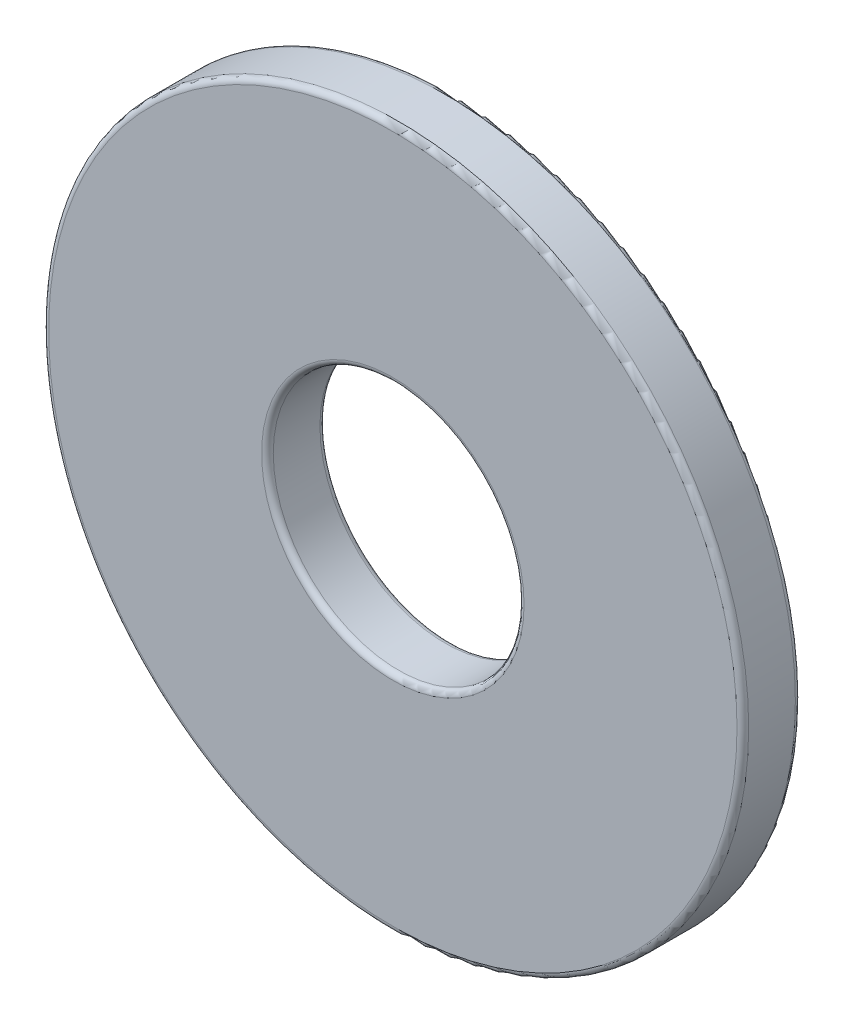
ISO-10303-21;
HEADER;
FILE_DESCRIPTION(('STEP AP214'),'2;1');
FILE_NAME('part.step','',(''),(''),'','','');
FILE_SCHEMA(('AUTOMOTIVE_DESIGN { 1 0 10303 214 1 1 1 1 }'));
ENDSEC;
DATA;
#1=APPLICATION_CONTEXT('core data for automotive mechanical design processes');
#2=APPLICATION_PROTOCOL_DEFINITION('international standard','automotive_design',2000,#1);
#3=PRODUCT_CONTEXT('',#1,'mechanical');
#4=PRODUCT('Part','Part','',(#3));
#5=PRODUCT_RELATED_PRODUCT_CATEGORY('part','',(#4));
#6=PRODUCT_DEFINITION_FORMATION('','',#4);
#7=PRODUCT_DEFINITION_CONTEXT('part definition',#1,'design');
#8=PRODUCT_DEFINITION('design','',#6,#7);
#9=PRODUCT_DEFINITION_SHAPE('','',#8);
#10=(LENGTH_UNIT() NAMED_UNIT(*) SI_UNIT(.MILLI.,.METRE.));
#11=(NAMED_UNIT(*) PLANE_ANGLE_UNIT() SI_UNIT($,.RADIAN.));
#12=(NAMED_UNIT(*) SI_UNIT($,.STERADIAN.) SOLID_ANGLE_UNIT());
#13=UNCERTAINTY_MEASURE_WITH_UNIT(LENGTH_MEASURE(1.E-05),#10,'distance_accuracy_value','');
#14=(GEOMETRIC_REPRESENTATION_CONTEXT(3) GLOBAL_UNCERTAINTY_ASSIGNED_CONTEXT((#13)) GLOBAL_UNIT_ASSIGNED_CONTEXT((#10,
#11,#12)) REPRESENTATION_CONTEXT('',''));
#15=CARTESIAN_POINT('',(0.,0.,0.));
#16=DIRECTION('',(0.,0.,1.));
#17=DIRECTION('',(1.,0.,0.));
#18=AXIS2_PLACEMENT_3D('',#15,#16,#17);
#19=CARTESIAN_POINT('',(0.,0.,0.1));
#20=DIRECTION('',(0.,0.,1.));
#21=DIRECTION('',(1.,0.,0.));
#22=AXIS2_PLACEMENT_3D('',#19,#20,#21);
#23=TOROIDAL_SURFACE('',#22,5.9,0.0999999999999997);
#24=CARTESIAN_POINT('',(0.,0.,0.));
#25=DIRECTION('',(0.,0.,1.));
#26=DIRECTION('',(1.,0.,0.));
#27=AXIS2_PLACEMENT_3D('',#24,#25,#26);
#28=CIRCLE('',#27,5.9);
#29=CARTESIAN_POINT('',(5.9,0.,0.));
#30=VERTEX_POINT('',#29);
#31=EDGE_CURVE('E10',#30,#30,#28,.T.);
#32=ORIENTED_EDGE('',*,*,#31,.T.);
#33=EDGE_LOOP('',(#32));
#34=FACE_BOUND('',#33,.T.);
#35=CARTESIAN_POINT('',(0.,0.,0.1));
#36=DIRECTION('',(0.,0.,1.));
#37=DIRECTION('',(1.,0.,0.));
#38=AXIS2_PLACEMENT_3D('',#35,#36,#37);
#39=CIRCLE('',#38,6.);
#40=CARTESIAN_POINT('',(6.,0.,0.1));
#41=VERTEX_POINT('',#40);
#42=EDGE_CURVE('E65',#41,#41,#39,.T.);
#43=ORIENTED_EDGE('',*,*,#42,.F.);
#44=EDGE_LOOP('',(#43));
#45=FACE_BOUND('',#44,.T.);
#46=ADVANCED_FACE('F37',(#34,#45),#23,.T.);
#47=CARTESIAN_POINT('',(5.9,0.,0.));
#48=DIRECTION('',(0.,0.,-1.));
#49=DIRECTION('',(-1.,0.,0.));
#50=AXIS2_PLACEMENT_3D('',#47,#48,#49);
#51=PLANE('',#50);
#52=CARTESIAN_POINT('',(0.,0.,0.));
#53=DIRECTION('',(0.,0.,1.));
#54=DIRECTION('',(1.,0.,0.));
#55=AXIS2_PLACEMENT_3D('',#52,#53,#54);
#56=CIRCLE('',#55,2.25);
#57=CARTESIAN_POINT('',(2.25,0.,0.));
#58=VERTEX_POINT('',#57);
#59=EDGE_CURVE('E43',#58,#58,#56,.T.);
#60=ORIENTED_EDGE('',*,*,#59,.T.);
#61=EDGE_LOOP('',(#60));
#62=FACE_BOUND('',#61,.T.);
#63=ORIENTED_EDGE('',*,*,#31,.F.);
#64=EDGE_LOOP('',(#63));
#65=FACE_BOUND('',#64,.T.);
#66=ADVANCED_FACE('F73',(#62,#65),#51,.T.);
#67=CARTESIAN_POINT('',(0.,0.,0.1));
#68=DIRECTION('',(0.,0.,1.));
#69=DIRECTION('',(1.,0.,0.));
#70=AXIS2_PLACEMENT_3D('',#67,#68,#69);
#71=TOROIDAL_SURFACE('',#70,2.25,0.0999999999999999);
#72=CARTESIAN_POINT('',(0.,0.,0.1));
#73=DIRECTION('',(0.,0.,1.));
#74=DIRECTION('',(1.,0.,0.));
#75=AXIS2_PLACEMENT_3D('',#72,#73,#74);
#76=CIRCLE('',#75,2.15);
#77=CARTESIAN_POINT('',(2.15,0.,0.1));
#78=VERTEX_POINT('',#77);
#79=EDGE_CURVE('E47',#78,#78,#76,.T.);
#80=ORIENTED_EDGE('',*,*,#79,.T.);
#81=EDGE_LOOP('',(#80));
#82=FACE_BOUND('',#81,.T.);
#83=ORIENTED_EDGE('',*,*,#59,.F.);
#84=EDGE_LOOP('',(#83));
#85=FACE_BOUND('',#84,.T.);
#86=ADVANCED_FACE('F77',(#82,#85),#71,.T.);
#87=CARTESIAN_POINT('',(0.,0.,-0.0024762682557373));
#88=DIRECTION('',(0.,0.,1.));
#89=DIRECTION('',(1.,0.,0.));
#90=AXIS2_PLACEMENT_3D('',#87,#88,#89);
#91=CYLINDRICAL_SURFACE('',#90,2.15);
#92=CARTESIAN_POINT('',(0.,0.,0.9));
#93=DIRECTION('',(0.,0.,1.));
#94=DIRECTION('',(1.,0.,0.));
#95=AXIS2_PLACEMENT_3D('',#92,#93,#94);
#96=CIRCLE('',#95,2.15);
#97=CARTESIAN_POINT('',(2.15,0.,0.9));
#98=VERTEX_POINT('',#97);
#99=EDGE_CURVE('E51',#98,#98,#96,.T.);
#100=ORIENTED_EDGE('',*,*,#99,.T.);
#101=EDGE_LOOP('',(#100));
#102=FACE_BOUND('',#101,.T.);
#103=ORIENTED_EDGE('',*,*,#79,.F.);
#104=EDGE_LOOP('',(#103));
#105=FACE_BOUND('',#104,.T.);
#106=ADVANCED_FACE('F81',(#102,#105),#91,.F.);
#107=CARTESIAN_POINT('',(0.,0.,0.9));
#108=DIRECTION('',(0.,0.,1.));
#109=DIRECTION('',(1.,0.,0.));
#110=AXIS2_PLACEMENT_3D('',#107,#108,#109);
#111=TOROIDAL_SURFACE('',#110,2.25,0.0999999999999999);
#112=CARTESIAN_POINT('',(0.,0.,1.));
#113=DIRECTION('',(0.,0.,1.));
#114=DIRECTION('',(1.,0.,0.));
#115=AXIS2_PLACEMENT_3D('',#112,#113,#114);
#116=CIRCLE('',#115,2.25);
#117=CARTESIAN_POINT('',(2.25,0.,1.));
#118=VERTEX_POINT('',#117);
#119=EDGE_CURVE('E56',#118,#118,#116,.T.);
#120=ORIENTED_EDGE('',*,*,#119,.T.);
#121=EDGE_LOOP('',(#120));
#122=FACE_BOUND('',#121,.T.);
#123=ORIENTED_EDGE('',*,*,#99,.F.);
#124=EDGE_LOOP('',(#123));
#125=FACE_BOUND('',#124,.T.);
#126=ADVANCED_FACE('F88',(#122,#125),#111,.T.);
#127=CARTESIAN_POINT('',(2.25,0.,1.));
#128=DIRECTION('',(0.,0.,1.));
#129=DIRECTION('',(1.,0.,0.));
#130=AXIS2_PLACEMENT_3D('',#127,#128,#129);
#131=PLANE('',#130);
#132=CARTESIAN_POINT('',(0.,0.,1.));
#133=DIRECTION('',(0.,0.,1.));
#134=DIRECTION('',(1.,0.,0.));
#135=AXIS2_PLACEMENT_3D('',#132,#133,#134);
#136=CIRCLE('',#135,5.9);
#137=CARTESIAN_POINT('',(5.9,0.,1.));
#138=VERTEX_POINT('',#137);
#139=EDGE_CURVE('E59',#138,#138,#136,.T.);
#140=ORIENTED_EDGE('',*,*,#139,.T.);
#141=EDGE_LOOP('',(#140));
#142=FACE_BOUND('',#141,.T.);
#143=ORIENTED_EDGE('',*,*,#119,.F.);
#144=EDGE_LOOP('',(#143));
#145=FACE_BOUND('',#144,.T.);
#146=ADVANCED_FACE('F92',(#142,#145),#131,.T.);
#147=CARTESIAN_POINT('',(0.,0.,0.9));
#148=DIRECTION('',(0.,0.,1.));
#149=DIRECTION('',(1.,0.,0.));
#150=AXIS2_PLACEMENT_3D('',#147,#148,#149);
#151=TOROIDAL_SURFACE('',#150,5.9,0.1);
#152=CARTESIAN_POINT('',(0.,0.,0.9));
#153=DIRECTION('',(0.,0.,1.));
#154=DIRECTION('',(1.,0.,0.));
#155=AXIS2_PLACEMENT_3D('',#152,#153,#154);
#156=CIRCLE('',#155,6.);
#157=CARTESIAN_POINT('',(6.,0.,0.9));
#158=VERTEX_POINT('',#157);
#159=EDGE_CURVE('E62',#158,#158,#156,.T.);
#160=ORIENTED_EDGE('',*,*,#159,.T.);
#161=EDGE_LOOP('',(#160));
#162=FACE_BOUND('',#161,.T.);
#163=ORIENTED_EDGE('',*,*,#139,.F.);
#164=EDGE_LOOP('',(#163));
#165=FACE_BOUND('',#164,.T.);
#166=ADVANCED_FACE('F96',(#162,#165),#151,.T.);
#167=CARTESIAN_POINT('',(0.,0.,-0.0024762682557373));
#168=DIRECTION('',(0.,0.,1.));
#169=DIRECTION('',(1.,0.,0.));
#170=AXIS2_PLACEMENT_3D('',#167,#168,#169);
#171=CYLINDRICAL_SURFACE('',#170,6.);
#172=ORIENTED_EDGE('',*,*,#42,.T.);
#173=EDGE_LOOP('',(#172));
#174=FACE_BOUND('',#173,.T.);
#175=ORIENTED_EDGE('',*,*,#159,.F.);
#176=EDGE_LOOP('',(#175));
#177=FACE_BOUND('',#176,.T.);
#178=ADVANCED_FACE('F69',(#174,#177),#171,.T.);
#179=CLOSED_SHELL('',(#46,#66,#86,#106,#126,#146,#166,#178));
#180=MANIFOLD_SOLID_BREP('B2',#179);
#181=ADVANCED_BREP_SHAPE_REPRESENTATION('',(#18,#180),#14);
#182=SHAPE_DEFINITION_REPRESENTATION(#9,#181);
ENDSEC;
END-ISO-10303-21;
